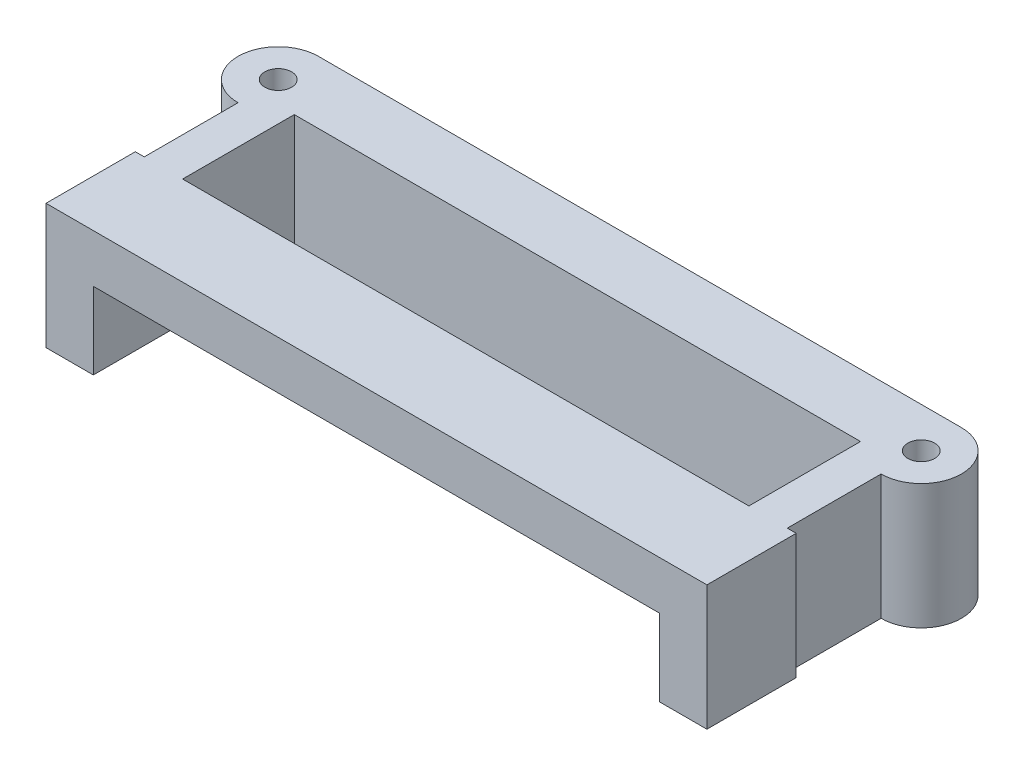
ISO-10303-21;
HEADER;
FILE_DESCRIPTION(('STEP AP214'),'2;1');
FILE_NAME('part.step','',(''),(''),'','','');
FILE_SCHEMA(('AUTOMOTIVE_DESIGN { 1 0 10303 214 1 1 1 1 }'));
ENDSEC;
DATA;
#1=APPLICATION_CONTEXT('core data for automotive mechanical design processes');
#2=APPLICATION_PROTOCOL_DEFINITION('international standard','automotive_design',2000,#1);
#3=PRODUCT_CONTEXT('',#1,'mechanical');
#4=PRODUCT('Part','Part','',(#3));
#5=PRODUCT_RELATED_PRODUCT_CATEGORY('part','',(#4));
#6=PRODUCT_DEFINITION_FORMATION('','',#4);
#7=PRODUCT_DEFINITION_CONTEXT('part definition',#1,'design');
#8=PRODUCT_DEFINITION('design','',#6,#7);
#9=PRODUCT_DEFINITION_SHAPE('','',#8);
#10=(LENGTH_UNIT() NAMED_UNIT(*) SI_UNIT(.MILLI.,.METRE.));
#11=(NAMED_UNIT(*) PLANE_ANGLE_UNIT() SI_UNIT($,.RADIAN.));
#12=(NAMED_UNIT(*) SI_UNIT($,.STERADIAN.) SOLID_ANGLE_UNIT());
#13=UNCERTAINTY_MEASURE_WITH_UNIT(LENGTH_MEASURE(1.E-05),#10,'distance_accuracy_value','');
#14=(GEOMETRIC_REPRESENTATION_CONTEXT(3) GLOBAL_UNCERTAINTY_ASSIGNED_CONTEXT((#13)) GLOBAL_UNIT_ASSIGNED_CONTEXT((#10,
#11,#12)) REPRESENTATION_CONTEXT('',''));
#15=CARTESIAN_POINT('',(0.,0.,0.));
#16=DIRECTION('',(0.,0.,1.));
#17=DIRECTION('',(1.,0.,0.));
#18=AXIS2_PLACEMENT_3D('',#15,#16,#17);
#19=CARTESIAN_POINT('',(73.,14.,-15.));
#20=DIRECTION('',(0.,1.,0.));
#21=DIRECTION('',(0.,0.,1.));
#22=AXIS2_PLACEMENT_3D('',#19,#20,#21);
#23=PLANE('',#22);
#24=CARTESIAN_POINT('',(0.999999999999998,14.,-15.));
#25=DIRECTION('',(0.,1.,0.));
#26=DIRECTION('',(0.,0.,1.));
#27=AXIS2_PLACEMENT_3D('',#24,#25,#26);
#28=CIRCLE('',#27,1.5);
#29=CARTESIAN_POINT('',(0.999999999999998,14.,-13.5));
#30=VERTEX_POINT('',#29);
#31=EDGE_CURVE('E189',#30,#30,#28,.T.);
#32=ORIENTED_EDGE('',*,*,#31,.F.);
#33=EDGE_LOOP('',(#32));
#34=FACE_BOUND('',#33,.T.);
#35=DIRECTION('',(0.,0.,1.));
#36=VECTOR('',#35,1.);
#37=CARTESIAN_POINT('',(0.,14.,0.));
#38=LINE('',#37,#36);
#39=CARTESIAN_POINT('',(0.,14.,0.));
#40=VERTEX_POINT('',#39);
#41=CARTESIAN_POINT('',(0.,14.,10.));
#42=VERTEX_POINT('',#41);
#43=EDGE_CURVE('E195',#40,#42,#38,.T.);
#44=ORIENTED_EDGE('',*,*,#43,.T.);
#45=DIRECTION('',(1.,0.,0.));
#46=VECTOR('',#45,1.);
#47=CARTESIAN_POINT('',(0.,14.,10.));
#48=LINE('',#47,#46);
#49=CARTESIAN_POINT('',(74.,14.,10.));
#50=VERTEX_POINT('',#49);
#51=EDGE_CURVE('E198',#42,#50,#48,.T.);
#52=ORIENTED_EDGE('',*,*,#51,.T.);
#53=DIRECTION('',(0.,0.,-1.));
#54=VECTOR('',#53,1.);
#55=CARTESIAN_POINT('',(74.,14.,0.));
#56=LINE('',#55,#54);
#57=CARTESIAN_POINT('',(74.,14.,0.));
#58=VERTEX_POINT('',#57);
#59=EDGE_CURVE('E201',#50,#58,#56,.T.);
#60=ORIENTED_EDGE('',*,*,#59,.T.);
#61=DIRECTION('',(-1.,0.,0.));
#62=VECTOR('',#61,1.);
#63=CARTESIAN_POINT('',(73.,14.,0.));
#64=LINE('',#63,#62);
#65=CARTESIAN_POINT('',(73.,14.,0.));
#66=VERTEX_POINT('',#65);
#67=EDGE_CURVE('E203',#58,#66,#64,.T.);
#68=ORIENTED_EDGE('',*,*,#67,.T.);
#69=DIRECTION('',(0.,0.,-1.));
#70=VECTOR('',#69,1.);
#71=CARTESIAN_POINT('',(73.,14.,-10.5));
#72=LINE('',#71,#70);
#73=CARTESIAN_POINT('',(73.,14.,-10.5));
#74=VERTEX_POINT('',#73);
#75=EDGE_CURVE('E205',#66,#74,#72,.T.);
#76=ORIENTED_EDGE('',*,*,#75,.T.);
#77=CARTESIAN_POINT('',(73.,14.,-15.));
#78=DIRECTION('',(0.,1.,0.));
#79=DIRECTION('',(0.,0.,1.));
#80=AXIS2_PLACEMENT_3D('',#77,#78,#79);
#81=CIRCLE('',#80,4.5);
#82=CARTESIAN_POINT('',(73.,14.,-19.5));
#83=VERTEX_POINT('',#82);
#84=EDGE_CURVE('E207',#74,#83,#81,.T.);
#85=ORIENTED_EDGE('',*,*,#84,.T.);
#86=DIRECTION('',(-1.,0.,0.));
#87=VECTOR('',#86,1.);
#88=CARTESIAN_POINT('',(0.999999999999983,14.,-19.5));
#89=LINE('',#88,#87);
#90=CARTESIAN_POINT('',(0.999999999999983,14.,-19.5));
#91=VERTEX_POINT('',#90);
#92=EDGE_CURVE('E209',#83,#91,#89,.T.);
#93=ORIENTED_EDGE('',*,*,#92,.T.);
#94=CARTESIAN_POINT('',(0.999999999999998,14.,-15.));
#95=DIRECTION('',(0.,1.,0.));
#96=DIRECTION('',(0.,0.,1.));
#97=AXIS2_PLACEMENT_3D('',#94,#95,#96);
#98=CIRCLE('',#97,4.5);
#99=CARTESIAN_POINT('',(0.999999999999998,14.,-10.5));
#100=VERTEX_POINT('',#99);
#101=EDGE_CURVE('E211',#91,#100,#98,.T.);
#102=ORIENTED_EDGE('',*,*,#101,.T.);
#103=DIRECTION('',(0.,0.,1.));
#104=VECTOR('',#103,1.);
#105=CARTESIAN_POINT('',(0.999999999999998,14.,-10.5));
#106=LINE('',#105,#104);
#107=CARTESIAN_POINT('',(0.999999999999998,14.,0.));
#108=VERTEX_POINT('',#107);
#109=EDGE_CURVE('E213',#100,#108,#106,.T.);
#110=ORIENTED_EDGE('',*,*,#109,.T.);
#111=DIRECTION('',(-1.,0.,0.));
#112=VECTOR('',#111,1.);
#113=CARTESIAN_POINT('',(0.,14.,0.));
#114=LINE('',#113,#112);
#115=EDGE_CURVE('E215',#108,#40,#114,.T.);
#116=ORIENTED_EDGE('',*,*,#115,.T.);
#117=EDGE_LOOP('',(#44,#52,#60,#68,#76,#85,#93,#102,#110,#116));
#118=FACE_BOUND('',#117,.T.);
#119=CARTESIAN_POINT('',(73.,14.,-15.));
#120=DIRECTION('',(0.,1.,0.));
#121=DIRECTION('',(0.,0.,1.));
#122=AXIS2_PLACEMENT_3D('',#119,#120,#121);
#123=CIRCLE('',#122,1.5);
#124=CARTESIAN_POINT('',(73.,14.,-13.5));
#125=VERTEX_POINT('',#124);
#126=EDGE_CURVE('E183',#125,#125,#123,.T.);
#127=ORIENTED_EDGE('',*,*,#126,.F.);
#128=EDGE_LOOP('',(#127));
#129=FACE_BOUND('',#128,.T.);
#130=DIRECTION('',(-1.,0.,0.));
#131=VECTOR('',#130,1.);
#132=CARTESIAN_POINT('',(5.3,14.,-12.5));
#133=LINE('',#132,#131);
#134=CARTESIAN_POINT('',(68.7,14.,-12.5));
#135=VERTEX_POINT('',#134);
#136=CARTESIAN_POINT('',(5.3,14.,-12.5));
#137=VERTEX_POINT('',#136);
#138=EDGE_CURVE('E313',#135,#137,#133,.T.);
#139=ORIENTED_EDGE('',*,*,#138,.F.);
#140=DIRECTION('',(0.,0.,-1.));
#141=VECTOR('',#140,1.);
#142=CARTESIAN_POINT('',(68.7,14.,-12.5));
#143=LINE('',#142,#141);
#144=CARTESIAN_POINT('',(68.7,14.,0.));
#145=VERTEX_POINT('',#144);
#146=EDGE_CURVE('E303',#145,#135,#143,.T.);
#147=ORIENTED_EDGE('',*,*,#146,.F.);
#148=DIRECTION('',(1.,0.,0.));
#149=VECTOR('',#148,1.);
#150=CARTESIAN_POINT('',(5.3,14.,0.));
#151=LINE('',#150,#149);
#152=CARTESIAN_POINT('',(5.3,14.,0.));
#153=VERTEX_POINT('',#152);
#154=EDGE_CURVE('E168',#153,#145,#151,.T.);
#155=ORIENTED_EDGE('',*,*,#154,.F.);
#156=DIRECTION('',(0.,0.,1.));
#157=VECTOR('',#156,1.);
#158=CARTESIAN_POINT('',(5.3,14.,-12.5));
#159=LINE('',#158,#157);
#160=EDGE_CURVE('E172',#137,#153,#159,.T.);
#161=ORIENTED_EDGE('',*,*,#160,.F.);
#162=EDGE_LOOP('',(#139,#147,#155,#161));
#163=FACE_BOUND('',#162,.T.);
#164=ADVANCED_FACE('F39',(#34,#118,#129,#163),#23,.T.);
#165=CARTESIAN_POINT('',(73.,0.,-15.));
#166=DIRECTION('',(0.,1.,0.));
#167=DIRECTION('',(0.,0.,1.));
#168=AXIS2_PLACEMENT_3D('',#165,#166,#167);
#169=PLANE('',#168);
#170=CARTESIAN_POINT('',(73.,0.,-15.));
#171=DIRECTION('',(0.,1.,0.));
#172=DIRECTION('',(0.,0.,1.));
#173=AXIS2_PLACEMENT_3D('',#170,#171,#172);
#174=CIRCLE('',#173,1.5);
#175=CARTESIAN_POINT('',(73.,0.,-13.5));
#176=VERTEX_POINT('',#175);
#177=EDGE_CURVE('E182',#176,#176,#174,.T.);
#178=ORIENTED_EDGE('',*,*,#177,.T.);
#179=EDGE_LOOP('',(#178));
#180=FACE_BOUND('',#179,.T.);
#181=CARTESIAN_POINT('',(0.999999999999998,0.,-15.));
#182=DIRECTION('',(0.,1.,0.));
#183=DIRECTION('',(0.,0.,1.));
#184=AXIS2_PLACEMENT_3D('',#181,#182,#183);
#185=CIRCLE('',#184,1.5);
#186=CARTESIAN_POINT('',(0.999999999999998,0.,-13.5));
#187=VERTEX_POINT('',#186);
#188=EDGE_CURVE('E186',#187,#187,#185,.T.);
#189=ORIENTED_EDGE('',*,*,#188,.T.);
#190=EDGE_LOOP('',(#189));
#191=FACE_BOUND('',#190,.T.);
#192=DIRECTION('',(0.,0.,1.));
#193=VECTOR('',#192,1.);
#194=CARTESIAN_POINT('',(5.3,0.,-12.5));
#195=LINE('',#194,#193);
#196=CARTESIAN_POINT('',(5.3,0.,-12.5));
#197=VERTEX_POINT('',#196);
#198=CARTESIAN_POINT('',(5.3,0.,10.));
#199=VERTEX_POINT('',#198);
#200=EDGE_CURVE('E175',#197,#199,#195,.T.);
#201=ORIENTED_EDGE('',*,*,#200,.T.);
#202=DIRECTION('',(1.,0.,0.));
#203=VECTOR('',#202,1.);
#204=CARTESIAN_POINT('',(0.,0.,10.));
#205=LINE('',#204,#203);
#206=CARTESIAN_POINT('',(0.,0.,10.));
#207=VERTEX_POINT('',#206);
#208=EDGE_CURVE('E221',#207,#199,#205,.T.);
#209=ORIENTED_EDGE('',*,*,#208,.F.);
#210=DIRECTION('',(0.,0.,1.));
#211=VECTOR('',#210,1.);
#212=CARTESIAN_POINT('',(0.,0.,0.));
#213=LINE('',#212,#211);
#214=CARTESIAN_POINT('',(0.,0.,0.));
#215=VERTEX_POINT('',#214);
#216=EDGE_CURVE('E192',#215,#207,#213,.T.);
#217=ORIENTED_EDGE('',*,*,#216,.F.);
#218=DIRECTION('',(-1.,0.,0.));
#219=VECTOR('',#218,1.);
#220=CARTESIAN_POINT('',(0.,0.,0.));
#221=LINE('',#220,#219);
#222=CARTESIAN_POINT('',(0.999999999999998,0.,0.));
#223=VERTEX_POINT('',#222);
#224=EDGE_CURVE('E199',#223,#215,#221,.T.);
#225=ORIENTED_EDGE('',*,*,#224,.F.);
#226=DIRECTION('',(0.,0.,1.));
#227=VECTOR('',#226,1.);
#228=CARTESIAN_POINT('',(0.999999999999998,0.,-10.5));
#229=LINE('',#228,#227);
#230=CARTESIAN_POINT('',(0.999999999999998,0.,-10.5));
#231=VERTEX_POINT('',#230);
#232=EDGE_CURVE('E236',#231,#223,#229,.T.);
#233=ORIENTED_EDGE('',*,*,#232,.F.);
#234=CARTESIAN_POINT('',(0.999999999999998,0.,-15.));
#235=DIRECTION('',(0.,1.,0.));
#236=DIRECTION('',(0.,0.,1.));
#237=AXIS2_PLACEMENT_3D('',#234,#235,#236);
#238=CIRCLE('',#237,4.5);
#239=CARTESIAN_POINT('',(0.999999999999983,0.,-19.5));
#240=VERTEX_POINT('',#239);
#241=EDGE_CURVE('E234',#240,#231,#238,.T.);
#242=ORIENTED_EDGE('',*,*,#241,.F.);
#243=DIRECTION('',(-1.,0.,0.));
#244=VECTOR('',#243,1.);
#245=CARTESIAN_POINT('',(0.999999999999983,0.,-19.5));
#246=LINE('',#245,#244);
#247=CARTESIAN_POINT('',(73.,0.,-19.5));
#248=VERTEX_POINT('',#247);
#249=EDGE_CURVE('E232',#248,#240,#246,.T.);
#250=ORIENTED_EDGE('',*,*,#249,.F.);
#251=CARTESIAN_POINT('',(73.,0.,-15.));
#252=DIRECTION('',(0.,1.,0.));
#253=DIRECTION('',(0.,0.,1.));
#254=AXIS2_PLACEMENT_3D('',#251,#252,#253);
#255=CIRCLE('',#254,4.5);
#256=CARTESIAN_POINT('',(73.,0.,-10.5));
#257=VERTEX_POINT('',#256);
#258=EDGE_CURVE('E230',#257,#248,#255,.T.);
#259=ORIENTED_EDGE('',*,*,#258,.F.);
#260=DIRECTION('',(0.,0.,-1.));
#261=VECTOR('',#260,1.);
#262=CARTESIAN_POINT('',(73.,0.,-10.5));
#263=LINE('',#262,#261);
#264=CARTESIAN_POINT('',(73.,0.,0.));
#265=VERTEX_POINT('',#264);
#266=EDGE_CURVE('E228',#265,#257,#263,.T.);
#267=ORIENTED_EDGE('',*,*,#266,.F.);
#268=DIRECTION('',(-1.,0.,0.));
#269=VECTOR('',#268,1.);
#270=CARTESIAN_POINT('',(73.,0.,0.));
#271=LINE('',#270,#269);
#272=CARTESIAN_POINT('',(74.,0.,0.));
#273=VERTEX_POINT('',#272);
#274=EDGE_CURVE('E226',#273,#265,#271,.T.);
#275=ORIENTED_EDGE('',*,*,#274,.F.);
#276=DIRECTION('',(0.,0.,-1.));
#277=VECTOR('',#276,1.);
#278=CARTESIAN_POINT('',(74.,0.,0.));
#279=LINE('',#278,#277);
#280=CARTESIAN_POINT('',(74.,0.,10.));
#281=VERTEX_POINT('',#280);
#282=EDGE_CURVE('E224',#281,#273,#279,.T.);
#283=ORIENTED_EDGE('',*,*,#282,.F.);
#284=CARTESIAN_POINT('',(68.7,0.,10.));
#285=VERTEX_POINT('',#284);
#286=EDGE_CURVE('E220',#285,#281,#205,.T.);
#287=ORIENTED_EDGE('',*,*,#286,.F.);
#288=DIRECTION('',(0.,0.,-1.));
#289=VECTOR('',#288,1.);
#290=CARTESIAN_POINT('',(68.7,0.,-12.5));
#291=LINE('',#290,#289);
#292=CARTESIAN_POINT('',(68.7,0.,-12.5));
#293=VERTEX_POINT('',#292);
#294=EDGE_CURVE('E306',#285,#293,#291,.T.);
#295=ORIENTED_EDGE('',*,*,#294,.T.);
#296=DIRECTION('',(-1.,0.,0.));
#297=VECTOR('',#296,1.);
#298=CARTESIAN_POINT('',(5.3,0.,-12.5));
#299=LINE('',#298,#297);
#300=EDGE_CURVE('E300',#293,#197,#299,.T.);
#301=ORIENTED_EDGE('',*,*,#300,.T.);
#302=EDGE_LOOP('',(#201,#209,#217,#225,#233,#242,#250,#259,#267,#275,#283,#287,#295,#301));
#303=FACE_BOUND('',#302,.T.);
#304=ADVANCED_FACE('F272',(#180,#191,#303),#169,.F.);
#305=CARTESIAN_POINT('',(0.,14.,0.));
#306=DIRECTION('',(1.,0.,0.));
#307=DIRECTION('',(0.,0.,-1.));
#308=AXIS2_PLACEMENT_3D('',#305,#306,#307);
#309=PLANE('',#308);
#310=ORIENTED_EDGE('',*,*,#216,.T.);
#311=DIRECTION('',(0.,-1.,0.));
#312=VECTOR('',#311,1.);
#313=CARTESIAN_POINT('',(0.,14.,10.));
#314=LINE('',#313,#312);
#315=EDGE_CURVE('E11',#42,#207,#314,.T.);
#316=ORIENTED_EDGE('',*,*,#315,.F.);
#317=ORIENTED_EDGE('',*,*,#43,.F.);
#318=DIRECTION('',(0.,-1.,0.));
#319=VECTOR('',#318,1.);
#320=CARTESIAN_POINT('',(0.,14.,0.));
#321=LINE('',#320,#319);
#322=EDGE_CURVE('E217',#40,#215,#321,.T.);
#323=ORIENTED_EDGE('',*,*,#322,.T.);
#324=EDGE_LOOP('',(#310,#316,#317,#323));
#325=FACE_BOUND('',#324,.T.);
#326=ADVANCED_FACE('F41',(#325),#309,.F.);
#327=CARTESIAN_POINT('',(0.,14.,10.));
#328=DIRECTION('',(0.,0.,-1.));
#329=DIRECTION('',(-1.,0.,0.));
#330=AXIS2_PLACEMENT_3D('',#327,#328,#329);
#331=PLANE('',#330);
#332=ORIENTED_EDGE('',*,*,#208,.T.);
#333=DIRECTION('',(0.,-1.,0.));
#334=VECTOR('',#333,1.);
#335=CARTESIAN_POINT('',(5.3,8.6,10.));
#336=LINE('',#335,#334);
#337=CARTESIAN_POINT('',(5.3,8.6,10.));
#338=VERTEX_POINT('',#337);
#339=EDGE_CURVE('E304',#338,#199,#336,.T.);
#340=ORIENTED_EDGE('',*,*,#339,.F.);
#341=DIRECTION('',(-1.,0.,0.));
#342=VECTOR('',#341,1.);
#343=CARTESIAN_POINT('',(5.3,8.6,10.));
#344=LINE('',#343,#342);
#345=CARTESIAN_POINT('',(68.7,8.6,10.));
#346=VERTEX_POINT('',#345);
#347=EDGE_CURVE('E161',#346,#338,#344,.T.);
#348=ORIENTED_EDGE('',*,*,#347,.F.);
#349=DIRECTION('',(0.,-1.,0.));
#350=VECTOR('',#349,1.);
#351=CARTESIAN_POINT('',(68.7,8.6,10.));
#352=LINE('',#351,#350);
#353=EDGE_CURVE('E159',#346,#285,#352,.T.);
#354=ORIENTED_EDGE('',*,*,#353,.T.);
#355=ORIENTED_EDGE('',*,*,#286,.T.);
#356=DIRECTION('',(0.,-1.,0.));
#357=VECTOR('',#356,1.);
#358=CARTESIAN_POINT('',(74.,14.,10.));
#359=LINE('',#358,#357);
#360=EDGE_CURVE('E47',#50,#281,#359,.T.);
#361=ORIENTED_EDGE('',*,*,#360,.F.);
#362=ORIENTED_EDGE('',*,*,#51,.F.);
#363=ORIENTED_EDGE('',*,*,#315,.T.);
#364=EDGE_LOOP('',(#332,#340,#348,#354,#355,#361,#362,#363));
#365=FACE_BOUND('',#364,.T.);
#366=ADVANCED_FACE('F290',(#365),#331,.F.);
#367=CARTESIAN_POINT('',(74.,14.,0.));
#368=DIRECTION('',(-1.,0.,0.));
#369=DIRECTION('',(0.,0.,1.));
#370=AXIS2_PLACEMENT_3D('',#367,#368,#369);
#371=PLANE('',#370);
#372=ORIENTED_EDGE('',*,*,#282,.T.);
#373=DIRECTION('',(0.,-1.,0.));
#374=VECTOR('',#373,1.);
#375=CARTESIAN_POINT('',(74.,14.,0.));
#376=LINE('',#375,#374);
#377=EDGE_CURVE('E259',#58,#273,#376,.T.);
#378=ORIENTED_EDGE('',*,*,#377,.F.);
#379=ORIENTED_EDGE('',*,*,#59,.F.);
#380=ORIENTED_EDGE('',*,*,#360,.T.);
#381=EDGE_LOOP('',(#372,#378,#379,#380));
#382=FACE_BOUND('',#381,.T.);
#383=ADVANCED_FACE('F266',(#382),#371,.F.);
#384=CARTESIAN_POINT('',(73.,14.,0.));
#385=DIRECTION('',(0.,0.,1.));
#386=DIRECTION('',(1.,0.,0.));
#387=AXIS2_PLACEMENT_3D('',#384,#385,#386);
#388=PLANE('',#387);
#389=ORIENTED_EDGE('',*,*,#274,.T.);
#390=DIRECTION('',(0.,-1.,0.));
#391=VECTOR('',#390,1.);
#392=CARTESIAN_POINT('',(73.,14.,0.));
#393=LINE('',#392,#391);
#394=EDGE_CURVE('E256',#66,#265,#393,.T.);
#395=ORIENTED_EDGE('',*,*,#394,.F.);
#396=ORIENTED_EDGE('',*,*,#67,.F.);
#397=ORIENTED_EDGE('',*,*,#377,.T.);
#398=EDGE_LOOP('',(#389,#395,#396,#397));
#399=FACE_BOUND('',#398,.T.);
#400=ADVANCED_FACE('F278',(#399),#388,.F.);
#401=CARTESIAN_POINT('',(73.,14.,-10.5));
#402=DIRECTION('',(-1.,0.,0.));
#403=DIRECTION('',(0.,0.,1.));
#404=AXIS2_PLACEMENT_3D('',#401,#402,#403);
#405=PLANE('',#404);
#406=ORIENTED_EDGE('',*,*,#266,.T.);
#407=DIRECTION('',(0.,-1.,0.));
#408=VECTOR('',#407,1.);
#409=CARTESIAN_POINT('',(73.,14.,-10.5));
#410=LINE('',#409,#408);
#411=EDGE_CURVE('E253',#74,#257,#410,.T.);
#412=ORIENTED_EDGE('',*,*,#411,.F.);
#413=ORIENTED_EDGE('',*,*,#75,.F.);
#414=ORIENTED_EDGE('',*,*,#394,.T.);
#415=EDGE_LOOP('',(#406,#412,#413,#414));
#416=FACE_BOUND('',#415,.T.);
#417=ADVANCED_FACE('F282',(#416),#405,.F.);
#418=CARTESIAN_POINT('',(73.,14.,-15.));
#419=DIRECTION('',(0.,-1.,0.));
#420=DIRECTION('',(0.,0.,-1.));
#421=AXIS2_PLACEMENT_3D('',#418,#419,#420);
#422=CYLINDRICAL_SURFACE('',#421,4.5);
#423=ORIENTED_EDGE('',*,*,#258,.T.);
#424=DIRECTION('',(0.,-1.,0.));
#425=VECTOR('',#424,1.);
#426=CARTESIAN_POINT('',(73.,14.,-19.5));
#427=LINE('',#426,#425);
#428=EDGE_CURVE('E250',#83,#248,#427,.T.);
#429=ORIENTED_EDGE('',*,*,#428,.F.);
#430=ORIENTED_EDGE('',*,*,#84,.F.);
#431=ORIENTED_EDGE('',*,*,#411,.T.);
#432=EDGE_LOOP('',(#423,#429,#430,#431));
#433=FACE_BOUND('',#432,.T.);
#434=ADVANCED_FACE('F358',(#433),#422,.T.);
#435=CARTESIAN_POINT('',(0.999999999999983,14.,-19.5));
#436=DIRECTION('',(0.,0.,1.));
#437=DIRECTION('',(1.,0.,0.));
#438=AXIS2_PLACEMENT_3D('',#435,#436,#437);
#439=PLANE('',#438);
#440=ORIENTED_EDGE('',*,*,#249,.T.);
#441=DIRECTION('',(0.,-1.,0.));
#442=VECTOR('',#441,1.);
#443=CARTESIAN_POINT('',(0.999999999999983,14.,-19.5));
#444=LINE('',#443,#442);
#445=EDGE_CURVE('E247',#91,#240,#444,.T.);
#446=ORIENTED_EDGE('',*,*,#445,.F.);
#447=ORIENTED_EDGE('',*,*,#92,.F.);
#448=ORIENTED_EDGE('',*,*,#428,.T.);
#449=EDGE_LOOP('',(#440,#446,#447,#448));
#450=FACE_BOUND('',#449,.T.);
#451=ADVANCED_FACE('F354',(#450),#439,.F.);
#452=CARTESIAN_POINT('',(0.999999999999998,14.,-15.));
#453=DIRECTION('',(0.,-1.,0.));
#454=DIRECTION('',(0.,0.,-1.));
#455=AXIS2_PLACEMENT_3D('',#452,#453,#454);
#456=CYLINDRICAL_SURFACE('',#455,4.5);
#457=ORIENTED_EDGE('',*,*,#241,.T.);
#458=DIRECTION('',(0.,-1.,0.));
#459=VECTOR('',#458,1.);
#460=CARTESIAN_POINT('',(0.999999999999998,14.,-10.5));
#461=LINE('',#460,#459);
#462=EDGE_CURVE('E244',#100,#231,#461,.T.);
#463=ORIENTED_EDGE('',*,*,#462,.F.);
#464=ORIENTED_EDGE('',*,*,#101,.F.);
#465=ORIENTED_EDGE('',*,*,#445,.T.);
#466=EDGE_LOOP('',(#457,#463,#464,#465));
#467=FACE_BOUND('',#466,.T.);
#468=ADVANCED_FACE('F350',(#467),#456,.T.);
#469=CARTESIAN_POINT('',(0.999999999999998,14.,-10.5));
#470=DIRECTION('',(1.,0.,0.));
#471=DIRECTION('',(0.,0.,-1.));
#472=AXIS2_PLACEMENT_3D('',#469,#470,#471);
#473=PLANE('',#472);
#474=ORIENTED_EDGE('',*,*,#232,.T.);
#475=DIRECTION('',(0.,-1.,0.));
#476=VECTOR('',#475,1.);
#477=CARTESIAN_POINT('',(0.999999999999998,14.,0.));
#478=LINE('',#477,#476);
#479=EDGE_CURVE('E241',#108,#223,#478,.T.);
#480=ORIENTED_EDGE('',*,*,#479,.F.);
#481=ORIENTED_EDGE('',*,*,#109,.F.);
#482=ORIENTED_EDGE('',*,*,#462,.T.);
#483=EDGE_LOOP('',(#474,#480,#481,#482));
#484=FACE_BOUND('',#483,.T.);
#485=ADVANCED_FACE('F346',(#484),#473,.F.);
#486=CARTESIAN_POINT('',(0.,14.,0.));
#487=DIRECTION('',(0.,0.,1.));
#488=DIRECTION('',(1.,0.,0.));
#489=AXIS2_PLACEMENT_3D('',#486,#487,#488);
#490=PLANE('',#489);
#491=ORIENTED_EDGE('',*,*,#224,.T.);
#492=ORIENTED_EDGE('',*,*,#322,.F.);
#493=ORIENTED_EDGE('',*,*,#115,.F.);
#494=ORIENTED_EDGE('',*,*,#479,.T.);
#495=EDGE_LOOP('',(#491,#492,#493,#494));
#496=FACE_BOUND('',#495,.T.);
#497=ADVANCED_FACE('F343',(#496),#490,.F.);
#498=CARTESIAN_POINT('',(0.999999999999998,14.,-15.));
#499=DIRECTION('',(0.,-1.,0.));
#500=DIRECTION('',(0.,0.,-1.));
#501=AXIS2_PLACEMENT_3D('',#498,#499,#500);
#502=CYLINDRICAL_SURFACE('',#501,1.5);
#503=ORIENTED_EDGE('',*,*,#31,.T.);
#504=EDGE_LOOP('',(#503));
#505=FACE_BOUND('',#504,.T.);
#506=ORIENTED_EDGE('',*,*,#188,.F.);
#507=EDGE_LOOP('',(#506));
#508=FACE_BOUND('',#507,.T.);
#509=ADVANCED_FACE('F340',(#505,#508),#502,.F.);
#510=CARTESIAN_POINT('',(73.,14.,-15.));
#511=DIRECTION('',(0.,-1.,0.));
#512=DIRECTION('',(0.,0.,-1.));
#513=AXIS2_PLACEMENT_3D('',#510,#511,#512);
#514=CYLINDRICAL_SURFACE('',#513,1.5);
#515=ORIENTED_EDGE('',*,*,#126,.T.);
#516=EDGE_LOOP('',(#515));
#517=FACE_BOUND('',#516,.T.);
#518=ORIENTED_EDGE('',*,*,#177,.F.);
#519=EDGE_LOOP('',(#518));
#520=FACE_BOUND('',#519,.T.);
#521=ADVANCED_FACE('F328',(#517,#520),#514,.F.);
#522=CARTESIAN_POINT('',(68.7,14.,-12.5));
#523=DIRECTION('',(-1.,0.,0.));
#524=DIRECTION('',(0.,0.,1.));
#525=AXIS2_PLACEMENT_3D('',#522,#523,#524);
#526=PLANE('',#525);
#527=ORIENTED_EDGE('',*,*,#294,.F.);
#528=ORIENTED_EDGE('',*,*,#353,.F.);
#529=DIRECTION('',(0.,0.,1.));
#530=VECTOR('',#529,1.);
#531=CARTESIAN_POINT('',(68.7,8.6,0.));
#532=LINE('',#531,#530);
#533=CARTESIAN_POINT('',(68.7,8.6,0.));
#534=VERTEX_POINT('',#533);
#535=EDGE_CURVE('E153',#534,#346,#532,.T.);
#536=ORIENTED_EDGE('',*,*,#535,.F.);
#537=DIRECTION('',(0.,-1.,0.));
#538=VECTOR('',#537,1.);
#539=CARTESIAN_POINT('',(68.7,14.,0.));
#540=LINE('',#539,#538);
#541=EDGE_CURVE('E156',#145,#534,#540,.T.);
#542=ORIENTED_EDGE('',*,*,#541,.F.);
#543=ORIENTED_EDGE('',*,*,#146,.T.);
#544=DIRECTION('',(0.,-1.,0.));
#545=VECTOR('',#544,1.);
#546=CARTESIAN_POINT('',(68.7,14.,-12.5));
#547=LINE('',#546,#545);
#548=EDGE_CURVE('E179',#135,#293,#547,.T.);
#549=ORIENTED_EDGE('',*,*,#548,.T.);
#550=EDGE_LOOP('',(#527,#528,#536,#542,#543,#549));
#551=FACE_BOUND('',#550,.T.);
#552=ADVANCED_FACE('F154',(#551),#526,.T.);
#553=CARTESIAN_POINT('',(5.3,14.,-12.5));
#554=DIRECTION('',(0.,0.,1.));
#555=DIRECTION('',(1.,0.,0.));
#556=AXIS2_PLACEMENT_3D('',#553,#554,#555);
#557=PLANE('',#556);
#558=ORIENTED_EDGE('',*,*,#300,.F.);
#559=ORIENTED_EDGE('',*,*,#548,.F.);
#560=ORIENTED_EDGE('',*,*,#138,.T.);
#561=DIRECTION('',(0.,-1.,0.));
#562=VECTOR('',#561,1.);
#563=CARTESIAN_POINT('',(5.3,14.,-12.5));
#564=LINE('',#563,#562);
#565=EDGE_CURVE('E170',#137,#197,#564,.T.);
#566=ORIENTED_EDGE('',*,*,#565,.T.);
#567=EDGE_LOOP('',(#558,#559,#560,#566));
#568=FACE_BOUND('',#567,.T.);
#569=ADVANCED_FACE('F320',(#568),#557,.T.);
#570=CARTESIAN_POINT('',(5.3,14.,-12.5));
#571=DIRECTION('',(1.,0.,0.));
#572=DIRECTION('',(0.,0.,-1.));
#573=AXIS2_PLACEMENT_3D('',#570,#571,#572);
#574=PLANE('',#573);
#575=ORIENTED_EDGE('',*,*,#200,.F.);
#576=ORIENTED_EDGE('',*,*,#565,.F.);
#577=ORIENTED_EDGE('',*,*,#160,.T.);
#578=DIRECTION('',(0.,-1.,0.));
#579=VECTOR('',#578,1.);
#580=CARTESIAN_POINT('',(5.3,14.,0.));
#581=LINE('',#580,#579);
#582=CARTESIAN_POINT('',(5.3,8.6,0.));
#583=VERTEX_POINT('',#582);
#584=EDGE_CURVE('E61',#153,#583,#581,.T.);
#585=ORIENTED_EDGE('',*,*,#584,.T.);
#586=DIRECTION('',(0.,0.,-1.));
#587=VECTOR('',#586,1.);
#588=CARTESIAN_POINT('',(5.3,8.6,0.));
#589=LINE('',#588,#587);
#590=EDGE_CURVE('E54',#338,#583,#589,.T.);
#591=ORIENTED_EDGE('',*,*,#590,.F.);
#592=ORIENTED_EDGE('',*,*,#339,.T.);
#593=EDGE_LOOP('',(#575,#576,#577,#585,#591,#592));
#594=FACE_BOUND('',#593,.T.);
#595=ADVANCED_FACE('F305',(#594),#574,.T.);
#596=CARTESIAN_POINT('',(5.3,14.,0.));
#597=DIRECTION('',(0.,0.,-1.));
#598=DIRECTION('',(-1.,0.,0.));
#599=AXIS2_PLACEMENT_3D('',#596,#597,#598);
#600=PLANE('',#599);
#601=DIRECTION('',(1.,0.,0.));
#602=VECTOR('',#601,1.);
#603=CARTESIAN_POINT('',(5.3,8.6,0.));
#604=LINE('',#603,#602);
#605=EDGE_CURVE('E162',#583,#534,#604,.T.);
#606=ORIENTED_EDGE('',*,*,#605,.F.);
#607=ORIENTED_EDGE('',*,*,#584,.F.);
#608=ORIENTED_EDGE('',*,*,#154,.T.);
#609=ORIENTED_EDGE('',*,*,#541,.T.);
#610=EDGE_LOOP('',(#606,#607,#608,#609));
#611=FACE_BOUND('',#610,.T.);
#612=ADVANCED_FACE('F166',(#611),#600,.T.);
#613=CARTESIAN_POINT('',(0.,8.6,0.));
#614=DIRECTION('',(0.,1.,0.));
#615=DIRECTION('',(0.,0.,1.));
#616=AXIS2_PLACEMENT_3D('',#613,#614,#615);
#617=PLANE('',#616);
#618=ORIENTED_EDGE('',*,*,#590,.T.);
#619=ORIENTED_EDGE('',*,*,#605,.T.);
#620=ORIENTED_EDGE('',*,*,#535,.T.);
#621=ORIENTED_EDGE('',*,*,#347,.T.);
#622=EDGE_LOOP('',(#618,#619,#620,#621));
#623=FACE_BOUND('',#622,.T.);
#624=ADVANCED_FACE('F164',(#623),#617,.F.);
#625=CLOSED_SHELL('',(#164,#304,#326,#366,#383,#400,#417,#434,#451,#468,#485,#497,#509,#521,
#552,#569,#595,#612,#624));
#626=MANIFOLD_SOLID_BREP('B2',#625);
#627=ADVANCED_BREP_SHAPE_REPRESENTATION('',(#18,#626),#14);
#628=SHAPE_DEFINITION_REPRESENTATION(#9,#627);
ENDSEC;
END-ISO-10303-21;
